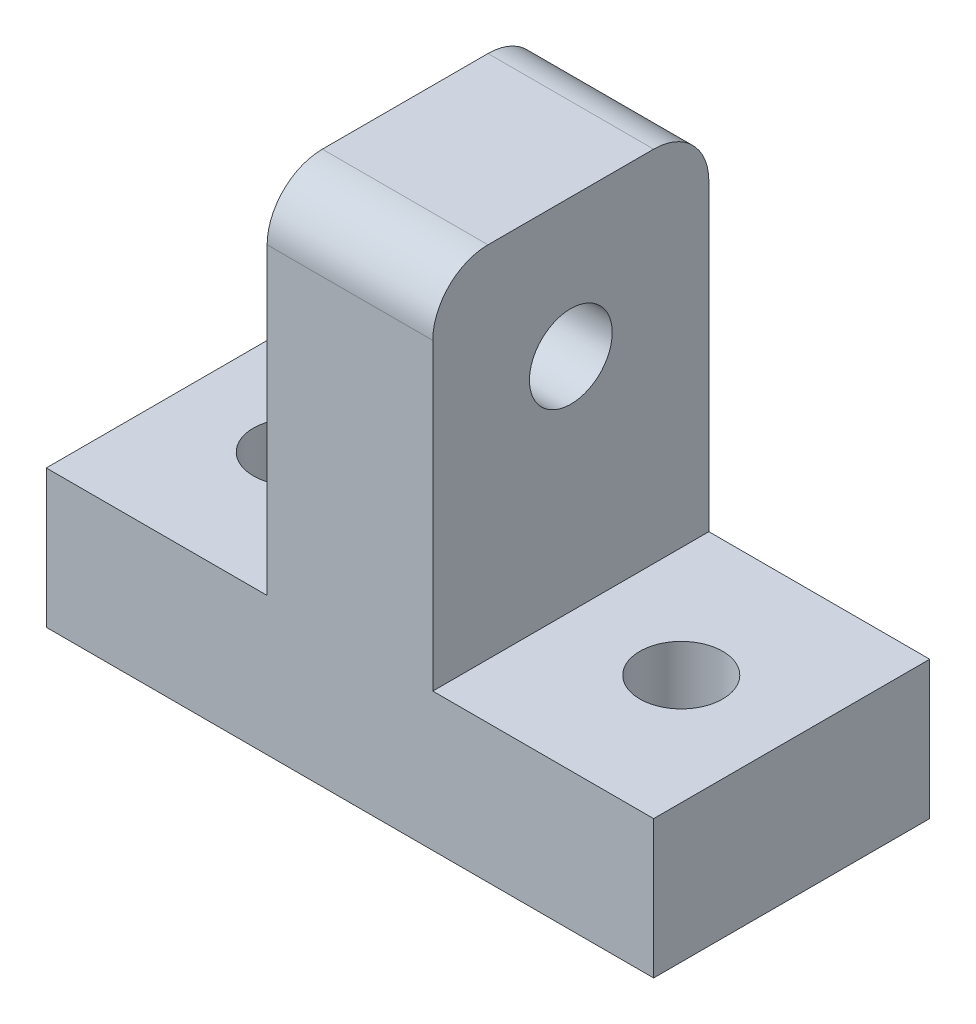
ISO-10303-21;
HEADER;
FILE_DESCRIPTION(('STEP AP214'),'2;1');
FILE_NAME('part.step','',(''),(''),'','','');
FILE_SCHEMA(('AUTOMOTIVE_DESIGN { 1 0 10303 214 1 1 1 1 }'));
ENDSEC;
DATA;
#1=APPLICATION_CONTEXT('core data for automotive mechanical design processes');
#2=APPLICATION_PROTOCOL_DEFINITION('international standard','automotive_design',2000,#1);
#3=PRODUCT_CONTEXT('',#1,'mechanical');
#4=PRODUCT('Part','Part','',(#3));
#5=PRODUCT_RELATED_PRODUCT_CATEGORY('part','',(#4));
#6=PRODUCT_DEFINITION_FORMATION('','',#4);
#7=PRODUCT_DEFINITION_CONTEXT('part definition',#1,'design');
#8=PRODUCT_DEFINITION('design','',#6,#7);
#9=PRODUCT_DEFINITION_SHAPE('','',#8);
#10=(LENGTH_UNIT() NAMED_UNIT(*) SI_UNIT(.MILLI.,.METRE.));
#11=(NAMED_UNIT(*) PLANE_ANGLE_UNIT() SI_UNIT($,.RADIAN.));
#12=(NAMED_UNIT(*) SI_UNIT($,.STERADIAN.) SOLID_ANGLE_UNIT());
#13=UNCERTAINTY_MEASURE_WITH_UNIT(LENGTH_MEASURE(1.E-05),#10,'distance_accuracy_value','');
#14=(GEOMETRIC_REPRESENTATION_CONTEXT(3) GLOBAL_UNCERTAINTY_ASSIGNED_CONTEXT((#13)) GLOBAL_UNIT_ASSIGNED_CONTEXT((#10,
#11,#12)) REPRESENTATION_CONTEXT('',''));
#15=CARTESIAN_POINT('',(0.,0.,0.));
#16=DIRECTION('',(0.,0.,1.));
#17=DIRECTION('',(1.,0.,0.));
#18=AXIS2_PLACEMENT_3D('',#15,#16,#17);
#19=CARTESIAN_POINT('',(0.,5.,0.));
#20=DIRECTION('',(0.,-1.,0.));
#21=DIRECTION('',(0.,0.,-1.));
#22=AXIS2_PLACEMENT_3D('',#19,#20,#21);
#23=PLANE('',#22);
#24=CARTESIAN_POINT('',(7.,5.,0.));
#25=DIRECTION('',(0.,1.,0.));
#26=DIRECTION('',(0.,0.,1.));
#27=AXIS2_PLACEMENT_3D('',#24,#25,#26);
#28=CIRCLE('',#27,1.5);
#29=CARTESIAN_POINT('',(7.,5.,1.5));
#30=VERTEX_POINT('',#29);
#31=EDGE_CURVE('E151',#30,#30,#28,.T.);
#32=ORIENTED_EDGE('',*,*,#31,.F.);
#33=EDGE_LOOP('',(#32));
#34=FACE_BOUND('',#33,.T.);
#35=DIRECTION('',(0.,0.,-1.));
#36=VECTOR('',#35,1.);
#37=CARTESIAN_POINT('',(3.,5.,5.));
#38=LINE('',#37,#36);
#39=CARTESIAN_POINT('',(3.,5.,5.));
#40=VERTEX_POINT('',#39);
#41=CARTESIAN_POINT('',(3.,5.,-5.));
#42=VERTEX_POINT('',#41);
#43=EDGE_CURVE('E136',#40,#42,#38,.T.);
#44=ORIENTED_EDGE('',*,*,#43,.F.);
#45=DIRECTION('',(1.,0.,0.));
#46=VECTOR('',#45,1.);
#47=CARTESIAN_POINT('',(-11.,5.,5.));
#48=LINE('',#47,#46);
#49=CARTESIAN_POINT('',(11.,5.,5.));
#50=VERTEX_POINT('',#49);
#51=EDGE_CURVE('E131',#40,#50,#48,.T.);
#52=ORIENTED_EDGE('',*,*,#51,.T.);
#53=DIRECTION('',(0.,0.,-1.));
#54=VECTOR('',#53,1.);
#55=CARTESIAN_POINT('',(11.,5.,5.));
#56=LINE('',#55,#54);
#57=CARTESIAN_POINT('',(11.,5.,-5.));
#58=VERTEX_POINT('',#57);
#59=EDGE_CURVE('E163',#50,#58,#56,.T.);
#60=ORIENTED_EDGE('',*,*,#59,.T.);
#61=DIRECTION('',(-1.,0.,0.));
#62=VECTOR('',#61,1.);
#63=CARTESIAN_POINT('',(-11.,5.,-5.));
#64=LINE('',#63,#62);
#65=EDGE_CURVE('E168',#58,#42,#64,.T.);
#66=ORIENTED_EDGE('',*,*,#65,.T.);
#67=EDGE_LOOP('',(#44,#52,#60,#66));
#68=FACE_BOUND('',#67,.T.);
#69=ADVANCED_FACE('F33',(#34,#68),#23,.F.);
#70=CARTESIAN_POINT('',(-7.,5.,0.));
#71=DIRECTION('',(0.,1.,0.));
#72=DIRECTION('',(0.,0.,1.));
#73=AXIS2_PLACEMENT_3D('',#70,#71,#72);
#74=CIRCLE('',#73,1.5);
#75=CARTESIAN_POINT('',(-7.,5.,1.5));
#76=VERTEX_POINT('',#75);
#77=EDGE_CURVE('E157',#76,#76,#74,.T.);
#78=ORIENTED_EDGE('',*,*,#77,.F.);
#79=EDGE_LOOP('',(#78));
#80=FACE_BOUND('',#79,.T.);
#81=DIRECTION('',(0.,0.,1.));
#82=VECTOR('',#81,1.);
#83=CARTESIAN_POINT('',(-3.,5.,5.));
#84=LINE('',#83,#82);
#85=CARTESIAN_POINT('',(-3.,5.,-5.));
#86=VERTEX_POINT('',#85);
#87=CARTESIAN_POINT('',(-3.,5.,5.));
#88=VERTEX_POINT('',#87);
#89=EDGE_CURVE('E125',#86,#88,#84,.T.);
#90=ORIENTED_EDGE('',*,*,#89,.F.);
#91=CARTESIAN_POINT('',(-11.,5.,-5.));
#92=VERTEX_POINT('',#91);
#93=EDGE_CURVE('E166',#86,#92,#64,.T.);
#94=ORIENTED_EDGE('',*,*,#93,.T.);
#95=DIRECTION('',(0.,0.,1.));
#96=VECTOR('',#95,1.);
#97=CARTESIAN_POINT('',(-11.,5.,5.));
#98=LINE('',#97,#96);
#99=CARTESIAN_POINT('',(-11.,5.,5.));
#100=VERTEX_POINT('',#99);
#101=EDGE_CURVE('E128',#92,#100,#98,.T.);
#102=ORIENTED_EDGE('',*,*,#101,.T.);
#103=EDGE_CURVE('E114',#100,#88,#48,.T.);
#104=ORIENTED_EDGE('',*,*,#103,.T.);
#105=EDGE_LOOP('',(#90,#94,#102,#104));
#106=FACE_BOUND('',#105,.T.);
#107=ADVANCED_FACE('F124',(#80,#106),#23,.F.);
#108=CARTESIAN_POINT('',(0.,0.,0.));
#109=DIRECTION('',(0.,-1.,0.));
#110=DIRECTION('',(0.,0.,-1.));
#111=AXIS2_PLACEMENT_3D('',#108,#109,#110);
#112=PLANE('',#111);
#113=CARTESIAN_POINT('',(-7.,0.,0.));
#114=DIRECTION('',(0.,1.,0.));
#115=DIRECTION('',(0.,0.,1.));
#116=AXIS2_PLACEMENT_3D('',#113,#114,#115);
#117=CIRCLE('',#116,1.5);
#118=CARTESIAN_POINT('',(-7.,0.,1.5));
#119=VERTEX_POINT('',#118);
#120=EDGE_CURVE('E154',#119,#119,#117,.T.);
#121=ORIENTED_EDGE('',*,*,#120,.T.);
#122=EDGE_LOOP('',(#121));
#123=FACE_BOUND('',#122,.T.);
#124=DIRECTION('',(0.,0.,-1.));
#125=VECTOR('',#124,1.);
#126=CARTESIAN_POINT('',(11.,0.,5.));
#127=LINE('',#126,#125);
#128=CARTESIAN_POINT('',(11.,0.,5.));
#129=VERTEX_POINT('',#128);
#130=CARTESIAN_POINT('',(11.,0.,-5.));
#131=VERTEX_POINT('',#130);
#132=EDGE_CURVE('E160',#129,#131,#127,.T.);
#133=ORIENTED_EDGE('',*,*,#132,.F.);
#134=DIRECTION('',(1.,0.,0.));
#135=VECTOR('',#134,1.);
#136=CARTESIAN_POINT('',(-11.,0.,5.));
#137=LINE('',#136,#135);
#138=CARTESIAN_POINT('',(-11.,0.,5.));
#139=VERTEX_POINT('',#138);
#140=EDGE_CURVE('E167',#139,#129,#137,.T.);
#141=ORIENTED_EDGE('',*,*,#140,.F.);
#142=DIRECTION('',(0.,0.,1.));
#143=VECTOR('',#142,1.);
#144=CARTESIAN_POINT('',(-11.,0.,5.));
#145=LINE('',#144,#143);
#146=CARTESIAN_POINT('',(-11.,0.,-5.));
#147=VERTEX_POINT('',#146);
#148=EDGE_CURVE('E176',#147,#139,#145,.T.);
#149=ORIENTED_EDGE('',*,*,#148,.F.);
#150=DIRECTION('',(-1.,0.,0.));
#151=VECTOR('',#150,1.);
#152=CARTESIAN_POINT('',(-11.,0.,-5.));
#153=LINE('',#152,#151);
#154=EDGE_CURVE('E174',#131,#147,#153,.T.);
#155=ORIENTED_EDGE('',*,*,#154,.F.);
#156=EDGE_LOOP('',(#133,#141,#149,#155));
#157=FACE_BOUND('',#156,.T.);
#158=CARTESIAN_POINT('',(7.,0.,0.));
#159=DIRECTION('',(0.,1.,0.));
#160=DIRECTION('',(0.,0.,1.));
#161=AXIS2_PLACEMENT_3D('',#158,#159,#160);
#162=CIRCLE('',#161,1.5);
#163=CARTESIAN_POINT('',(7.,0.,1.5));
#164=VERTEX_POINT('',#163);
#165=EDGE_CURVE('E150',#164,#164,#162,.T.);
#166=ORIENTED_EDGE('',*,*,#165,.T.);
#167=EDGE_LOOP('',(#166));
#168=FACE_BOUND('',#167,.T.);
#169=ADVANCED_FACE('F218',(#123,#157,#168),#112,.T.);
#170=CARTESIAN_POINT('',(11.,5.,5.));
#171=DIRECTION('',(-1.,0.,0.));
#172=DIRECTION('',(0.,0.,1.));
#173=AXIS2_PLACEMENT_3D('',#170,#171,#172);
#174=PLANE('',#173);
#175=ORIENTED_EDGE('',*,*,#132,.T.);
#176=DIRECTION('',(0.,-1.,0.));
#177=VECTOR('',#176,1.);
#178=CARTESIAN_POINT('',(11.,5.,-5.));
#179=LINE('',#178,#177);
#180=EDGE_CURVE('E186',#58,#131,#179,.T.);
#181=ORIENTED_EDGE('',*,*,#180,.F.);
#182=ORIENTED_EDGE('',*,*,#59,.F.);
#183=DIRECTION('',(0.,-1.,0.));
#184=VECTOR('',#183,1.);
#185=CARTESIAN_POINT('',(11.,5.,5.));
#186=LINE('',#185,#184);
#187=EDGE_CURVE('E130',#50,#129,#186,.T.);
#188=ORIENTED_EDGE('',*,*,#187,.T.);
#189=EDGE_LOOP('',(#175,#181,#182,#188));
#190=FACE_BOUND('',#189,.T.);
#191=ADVANCED_FACE('F222',(#190),#174,.F.);
#192=CARTESIAN_POINT('',(-11.,5.,-5.));
#193=DIRECTION('',(0.,0.,1.));
#194=DIRECTION('',(1.,0.,0.));
#195=AXIS2_PLACEMENT_3D('',#192,#193,#194);
#196=PLANE('',#195);
#197=DIRECTION('',(0.,-1.,0.));
#198=VECTOR('',#197,1.);
#199=CARTESIAN_POINT('',(-3.,18.,-5.));
#200=LINE('',#199,#198);
#201=CARTESIAN_POINT('',(-3.,16.,-5.));
#202=VERTEX_POINT('',#201);
#203=EDGE_CURVE('E119',#202,#86,#200,.T.);
#204=ORIENTED_EDGE('',*,*,#203,.F.);
#205=DIRECTION('',(-1.,0.,0.));
#206=VECTOR('',#205,1.);
#207=CARTESIAN_POINT('',(-11.,16.,-5.));
#208=LINE('',#207,#206);
#209=CARTESIAN_POINT('',(3.,16.,-5.));
#210=VERTEX_POINT('',#209);
#211=EDGE_CURVE('E56',#202,#210,#208,.F.);
#212=ORIENTED_EDGE('',*,*,#211,.T.);
#213=DIRECTION('',(0.,-1.,0.));
#214=VECTOR('',#213,1.);
#215=CARTESIAN_POINT('',(3.,18.,-5.));
#216=LINE('',#215,#214);
#217=EDGE_CURVE('E148',#210,#42,#216,.T.);
#218=ORIENTED_EDGE('',*,*,#217,.T.);
#219=ORIENTED_EDGE('',*,*,#65,.F.);
#220=ORIENTED_EDGE('',*,*,#180,.T.);
#221=ORIENTED_EDGE('',*,*,#154,.T.);
#222=DIRECTION('',(0.,-1.,0.));
#223=VECTOR('',#222,1.);
#224=CARTESIAN_POINT('',(-11.,5.,-5.));
#225=LINE('',#224,#223);
#226=EDGE_CURVE('E183',#92,#147,#225,.T.);
#227=ORIENTED_EDGE('',*,*,#226,.F.);
#228=ORIENTED_EDGE('',*,*,#93,.F.);
#229=EDGE_LOOP('',(#204,#212,#218,#219,#220,#221,#227,#228));
#230=FACE_BOUND('',#229,.T.);
#231=ADVANCED_FACE('F209',(#230),#196,.F.);
#232=CARTESIAN_POINT('',(-11.,5.,5.));
#233=DIRECTION('',(1.,0.,0.));
#234=DIRECTION('',(0.,0.,-1.));
#235=AXIS2_PLACEMENT_3D('',#232,#233,#234);
#236=PLANE('',#235);
#237=ORIENTED_EDGE('',*,*,#148,.T.);
#238=DIRECTION('',(0.,-1.,0.));
#239=VECTOR('',#238,1.);
#240=CARTESIAN_POINT('',(-11.,5.,5.));
#241=LINE('',#240,#239);
#242=EDGE_CURVE('E181',#100,#139,#241,.T.);
#243=ORIENTED_EDGE('',*,*,#242,.F.);
#244=ORIENTED_EDGE('',*,*,#101,.F.);
#245=ORIENTED_EDGE('',*,*,#226,.T.);
#246=EDGE_LOOP('',(#237,#243,#244,#245));
#247=FACE_BOUND('',#246,.T.);
#248=ADVANCED_FACE('F213',(#247),#236,.F.);
#249=CARTESIAN_POINT('',(-11.,5.,5.));
#250=DIRECTION('',(0.,0.,-1.));
#251=DIRECTION('',(-1.,0.,0.));
#252=AXIS2_PLACEMENT_3D('',#249,#250,#251);
#253=PLANE('',#252);
#254=DIRECTION('',(0.,-1.,0.));
#255=VECTOR('',#254,1.);
#256=CARTESIAN_POINT('',(3.,18.,5.));
#257=LINE('',#256,#255);
#258=CARTESIAN_POINT('',(3.,16.,5.));
#259=VERTEX_POINT('',#258);
#260=EDGE_CURVE('E120',#259,#40,#257,.T.);
#261=ORIENTED_EDGE('',*,*,#260,.F.);
#262=DIRECTION('',(1.,0.,0.));
#263=VECTOR('',#262,1.);
#264=CARTESIAN_POINT('',(-11.,16.,5.));
#265=LINE('',#264,#263);
#266=CARTESIAN_POINT('',(-3.,16.,5.));
#267=VERTEX_POINT('',#266);
#268=EDGE_CURVE('E11',#259,#267,#265,.F.);
#269=ORIENTED_EDGE('',*,*,#268,.T.);
#270=DIRECTION('',(0.,-1.,0.));
#271=VECTOR('',#270,1.);
#272=CARTESIAN_POINT('',(-3.,18.,5.));
#273=LINE('',#272,#271);
#274=EDGE_CURVE('E110',#267,#88,#273,.T.);
#275=ORIENTED_EDGE('',*,*,#274,.T.);
#276=ORIENTED_EDGE('',*,*,#103,.F.);
#277=ORIENTED_EDGE('',*,*,#242,.T.);
#278=ORIENTED_EDGE('',*,*,#140,.T.);
#279=ORIENTED_EDGE('',*,*,#187,.F.);
#280=ORIENTED_EDGE('',*,*,#51,.F.);
#281=EDGE_LOOP('',(#261,#269,#275,#276,#277,#278,#279,#280));
#282=FACE_BOUND('',#281,.T.);
#283=ADVANCED_FACE('F112',(#282),#253,.F.);
#284=CARTESIAN_POINT('',(-7.,5.,0.));
#285=DIRECTION('',(0.,-1.,0.));
#286=DIRECTION('',(0.,0.,-1.));
#287=AXIS2_PLACEMENT_3D('',#284,#285,#286);
#288=CYLINDRICAL_SURFACE('',#287,1.5);
#289=ORIENTED_EDGE('',*,*,#77,.T.);
#290=EDGE_LOOP('',(#289));
#291=FACE_BOUND('',#290,.T.);
#292=ORIENTED_EDGE('',*,*,#120,.F.);
#293=EDGE_LOOP('',(#292));
#294=FACE_BOUND('',#293,.T.);
#295=ADVANCED_FACE('F237',(#291,#294),#288,.F.);
#296=CARTESIAN_POINT('',(7.,5.,0.));
#297=DIRECTION('',(0.,-1.,0.));
#298=DIRECTION('',(0.,0.,-1.));
#299=AXIS2_PLACEMENT_3D('',#296,#297,#298);
#300=CYLINDRICAL_SURFACE('',#299,1.5);
#301=ORIENTED_EDGE('',*,*,#31,.T.);
#302=EDGE_LOOP('',(#301));
#303=FACE_BOUND('',#302,.T.);
#304=ORIENTED_EDGE('',*,*,#165,.F.);
#305=EDGE_LOOP('',(#304));
#306=FACE_BOUND('',#305,.T.);
#307=ADVANCED_FACE('F269',(#303,#306),#300,.F.);
#308=CARTESIAN_POINT('',(3.,18.,5.));
#309=DIRECTION('',(-1.,0.,0.));
#310=DIRECTION('',(0.,0.,1.));
#311=AXIS2_PLACEMENT_3D('',#308,#309,#310);
#312=PLANE('',#311);
#313=CARTESIAN_POINT('',(3.,13.,0.));
#314=DIRECTION('',(1.,0.,0.));
#315=DIRECTION('',(0.,0.,-1.));
#316=AXIS2_PLACEMENT_3D('',#313,#314,#315);
#317=CIRCLE('',#316,1.5);
#318=CARTESIAN_POINT('',(3.,13.,-1.5));
#319=VERTEX_POINT('',#318);
#320=EDGE_CURVE('E371',#319,#319,#317,.T.);
#321=ORIENTED_EDGE('',*,*,#320,.F.);
#322=EDGE_LOOP('',(#321));
#323=FACE_BOUND('',#322,.T.);
#324=ORIENTED_EDGE('',*,*,#217,.F.);
#325=CARTESIAN_POINT('',(3.,16.,-3.));
#326=DIRECTION('',(-1.,0.,0.));
#327=DIRECTION('',(0.,0.,1.));
#328=AXIS2_PLACEMENT_3D('',#325,#326,#327);
#329=CIRCLE('',#328,2.);
#330=CARTESIAN_POINT('',(3.,18.,-3.));
#331=VERTEX_POINT('',#330);
#332=EDGE_CURVE('E41',#210,#331,#329,.F.);
#333=ORIENTED_EDGE('',*,*,#332,.T.);
#334=DIRECTION('',(0.,0.,-1.));
#335=VECTOR('',#334,1.);
#336=CARTESIAN_POINT('',(3.,18.,5.));
#337=LINE('',#336,#335);
#338=CARTESIAN_POINT('',(3.,18.,3.));
#339=VERTEX_POINT('',#338);
#340=EDGE_CURVE('E135',#339,#331,#337,.T.);
#341=ORIENTED_EDGE('',*,*,#340,.F.);
#342=CARTESIAN_POINT('',(3.,16.,3.));
#343=DIRECTION('',(-1.,0.,0.));
#344=DIRECTION('',(0.,0.,1.));
#345=AXIS2_PLACEMENT_3D('',#342,#343,#344);
#346=CIRCLE('',#345,2.);
#347=EDGE_CURVE('E48',#339,#259,#346,.F.);
#348=ORIENTED_EDGE('',*,*,#347,.T.);
#349=ORIENTED_EDGE('',*,*,#260,.T.);
#350=ORIENTED_EDGE('',*,*,#43,.T.);
#351=EDGE_LOOP('',(#324,#333,#341,#348,#349,#350));
#352=FACE_BOUND('',#351,.T.);
#353=ADVANCED_FACE('F201',(#323,#352),#312,.F.);
#354=CARTESIAN_POINT('',(-3.,18.,5.));
#355=DIRECTION('',(1.,0.,0.));
#356=DIRECTION('',(0.,0.,-1.));
#357=AXIS2_PLACEMENT_3D('',#354,#355,#356);
#358=PLANE('',#357);
#359=CARTESIAN_POINT('',(-3.,13.,0.));
#360=DIRECTION('',(1.,0.,0.));
#361=DIRECTION('',(0.,0.,-1.));
#362=AXIS2_PLACEMENT_3D('',#359,#360,#361);
#363=CIRCLE('',#362,1.5);
#364=CARTESIAN_POINT('',(-3.,13.,-1.5));
#365=VERTEX_POINT('',#364);
#366=EDGE_CURVE('E142',#365,#365,#363,.F.);
#367=ORIENTED_EDGE('',*,*,#366,.F.);
#368=EDGE_LOOP('',(#367));
#369=FACE_BOUND('',#368,.T.);
#370=DIRECTION('',(0.,0.,1.));
#371=VECTOR('',#370,1.);
#372=CARTESIAN_POINT('',(-3.,18.,5.));
#373=LINE('',#372,#371);
#374=CARTESIAN_POINT('',(-3.,18.,-3.));
#375=VERTEX_POINT('',#374);
#376=CARTESIAN_POINT('',(-3.,18.,3.));
#377=VERTEX_POINT('',#376);
#378=EDGE_CURVE('E139',#375,#377,#373,.T.);
#379=ORIENTED_EDGE('',*,*,#378,.F.);
#380=CARTESIAN_POINT('',(-3.,16.,-3.));
#381=DIRECTION('',(1.,0.,0.));
#382=DIRECTION('',(0.,0.,-1.));
#383=AXIS2_PLACEMENT_3D('',#380,#381,#382);
#384=CIRCLE('',#383,2.);
#385=EDGE_CURVE('E197',#375,#202,#384,.F.);
#386=ORIENTED_EDGE('',*,*,#385,.T.);
#387=ORIENTED_EDGE('',*,*,#203,.T.);
#388=ORIENTED_EDGE('',*,*,#89,.T.);
#389=ORIENTED_EDGE('',*,*,#274,.F.);
#390=CARTESIAN_POINT('',(-3.,16.,3.));
#391=DIRECTION('',(1.,0.,0.));
#392=DIRECTION('',(0.,0.,-1.));
#393=AXIS2_PLACEMENT_3D('',#390,#391,#392);
#394=CIRCLE('',#393,2.);
#395=EDGE_CURVE('E195',#267,#377,#394,.F.);
#396=ORIENTED_EDGE('',*,*,#395,.T.);
#397=EDGE_LOOP('',(#379,#386,#387,#388,#389,#396));
#398=FACE_BOUND('',#397,.T.);
#399=ADVANCED_FACE('F134',(#369,#398),#358,.F.);
#400=CARTESIAN_POINT('',(0.,18.,0.));
#401=DIRECTION('',(0.,-1.,0.));
#402=DIRECTION('',(0.,0.,-1.));
#403=AXIS2_PLACEMENT_3D('',#400,#401,#402);
#404=PLANE('',#403);
#405=ORIENTED_EDGE('',*,*,#340,.T.);
#406=DIRECTION('',(-1.,0.,0.));
#407=VECTOR('',#406,1.);
#408=CARTESIAN_POINT('',(0.,18.,-3.));
#409=LINE('',#408,#407);
#410=EDGE_CURVE('E192',#331,#375,#409,.T.);
#411=ORIENTED_EDGE('',*,*,#410,.T.);
#412=ORIENTED_EDGE('',*,*,#378,.T.);
#413=DIRECTION('',(1.,0.,0.));
#414=VECTOR('',#413,1.);
#415=CARTESIAN_POINT('',(0.,18.,3.));
#416=LINE('',#415,#414);
#417=EDGE_CURVE('E189',#377,#339,#416,.T.);
#418=ORIENTED_EDGE('',*,*,#417,.T.);
#419=EDGE_LOOP('',(#405,#411,#412,#418));
#420=FACE_BOUND('',#419,.T.);
#421=ADVANCED_FACE('F205',(#420),#404,.F.);
#422=CARTESIAN_POINT('',(-11.001,13.,0.));
#423=DIRECTION('',(1.,0.,0.));
#424=DIRECTION('',(0.,0.,-1.));
#425=AXIS2_PLACEMENT_3D('',#422,#423,#424);
#426=CYLINDRICAL_SURFACE('',#425,1.5);
#427=ORIENTED_EDGE('',*,*,#320,.T.);
#428=EDGE_LOOP('',(#427));
#429=FACE_BOUND('',#428,.T.);
#430=ORIENTED_EDGE('',*,*,#366,.T.);
#431=EDGE_LOOP('',(#430));
#432=FACE_BOUND('',#431,.T.);
#433=ADVANCED_FACE('F250',(#429,#432),#426,.F.);
#434=CARTESIAN_POINT('',(0.,16.,-3.));
#435=DIRECTION('',(-1.,0.,0.));
#436=DIRECTION('',(0.,0.,1.));
#437=AXIS2_PLACEMENT_3D('',#434,#435,#436);
#438=CYLINDRICAL_SURFACE('',#437,2.);
#439=ORIENTED_EDGE('',*,*,#332,.F.);
#440=ORIENTED_EDGE('',*,*,#211,.F.);
#441=ORIENTED_EDGE('',*,*,#385,.F.);
#442=ORIENTED_EDGE('',*,*,#410,.F.);
#443=EDGE_LOOP('',(#439,#440,#441,#442));
#444=FACE_BOUND('',#443,.T.);
#445=ADVANCED_FACE('F208',(#444),#438,.T.);
#446=CARTESIAN_POINT('',(0.,16.,3.));
#447=DIRECTION('',(1.,0.,0.));
#448=DIRECTION('',(0.,0.,-1.));
#449=AXIS2_PLACEMENT_3D('',#446,#447,#448);
#450=CYLINDRICAL_SURFACE('',#449,2.);
#451=ORIENTED_EDGE('',*,*,#395,.F.);
#452=ORIENTED_EDGE('',*,*,#268,.F.);
#453=ORIENTED_EDGE('',*,*,#347,.F.);
#454=ORIENTED_EDGE('',*,*,#417,.F.);
#455=EDGE_LOOP('',(#451,#452,#453,#454));
#456=FACE_BOUND('',#455,.T.);
#457=ADVANCED_FACE('F35',(#456),#450,.T.);
#458=CLOSED_SHELL('',(#69,#107,#169,#191,#231,#248,#283,#295,#307,#353,#399,#421,#433,#445,#457));
#459=MANIFOLD_SOLID_BREP('B2',#458);
#460=ADVANCED_BREP_SHAPE_REPRESENTATION('',(#18,#459),#14);
#461=SHAPE_DEFINITION_REPRESENTATION(#9,#460);
ENDSEC;
END-ISO-10303-21;
